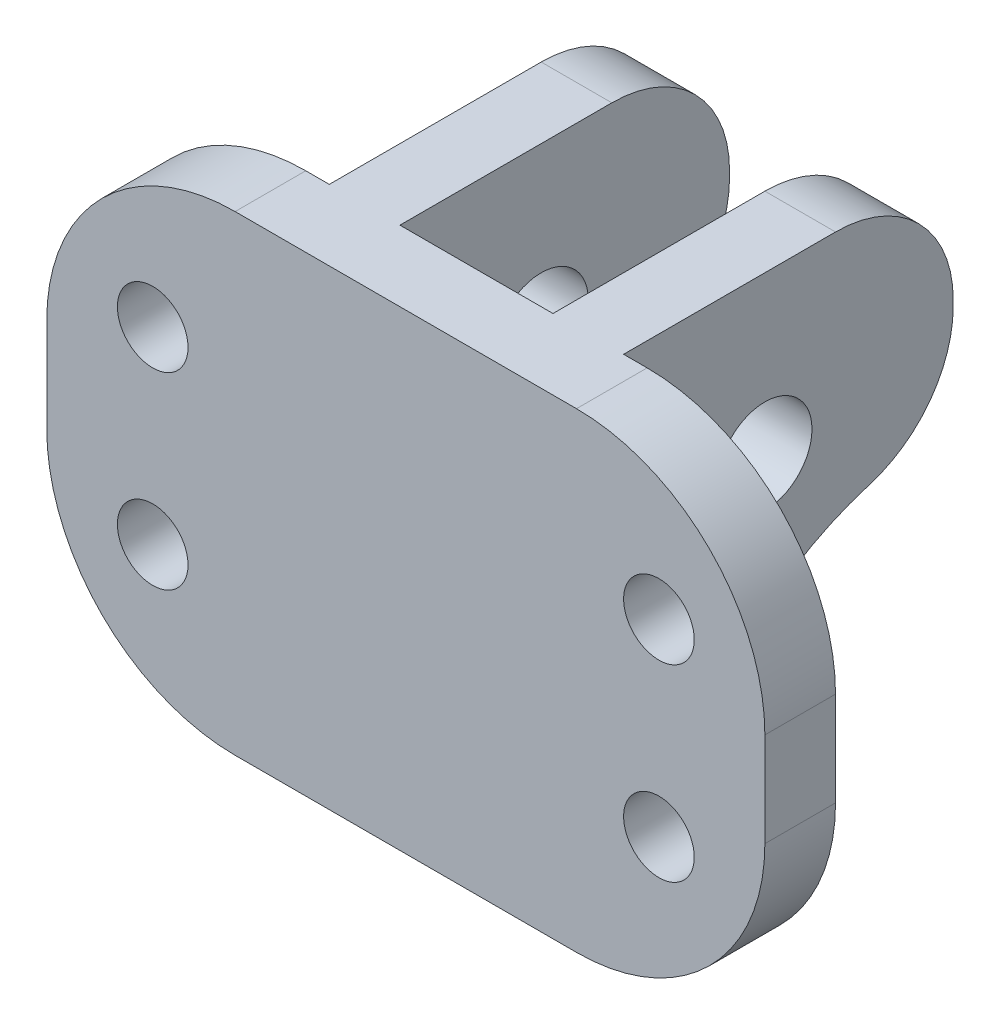
ISO-10303-21;
HEADER;
FILE_DESCRIPTION(('STEP AP214'),'2;1');
FILE_NAME('part.step','',(''),(''),'','','');
FILE_SCHEMA(('AUTOMOTIVE_DESIGN { 1 0 10303 214 1 1 1 1 }'));
ENDSEC;
DATA;
#1=APPLICATION_CONTEXT('core data for automotive mechanical design processes');
#2=APPLICATION_PROTOCOL_DEFINITION('international standard','automotive_design',2000,#1);
#3=PRODUCT_CONTEXT('',#1,'mechanical');
#4=PRODUCT('Part','Part','',(#3));
#5=PRODUCT_RELATED_PRODUCT_CATEGORY('part','',(#4));
#6=PRODUCT_DEFINITION_FORMATION('','',#4);
#7=PRODUCT_DEFINITION_CONTEXT('part definition',#1,'design');
#8=PRODUCT_DEFINITION('design','',#6,#7);
#9=PRODUCT_DEFINITION_SHAPE('','',#8);
#10=(LENGTH_UNIT() NAMED_UNIT(*) SI_UNIT(.MILLI.,.METRE.));
#11=(NAMED_UNIT(*) PLANE_ANGLE_UNIT() SI_UNIT($,.RADIAN.));
#12=(NAMED_UNIT(*) SI_UNIT($,.STERADIAN.) SOLID_ANGLE_UNIT());
#13=UNCERTAINTY_MEASURE_WITH_UNIT(LENGTH_MEASURE(1.E-05),#10,'distance_accuracy_value','');
#14=(GEOMETRIC_REPRESENTATION_CONTEXT(3) GLOBAL_UNCERTAINTY_ASSIGNED_CONTEXT((#13)) GLOBAL_UNIT_ASSIGNED_CONTEXT((#10,
#11,#12)) REPRESENTATION_CONTEXT('',''));
#15=CARTESIAN_POINT('',(0.,0.,0.));
#16=DIRECTION('',(0.,0.,1.));
#17=DIRECTION('',(1.,0.,0.));
#18=AXIS2_PLACEMENT_3D('',#15,#16,#17);
#19=CARTESIAN_POINT('',(-6.25,27.,0.));
#20=DIRECTION('',(-1.,0.,0.));
#21=DIRECTION('',(0.,0.,1.));
#22=AXIS2_PLACEMENT_3D('',#19,#20,#21);
#23=PLANE('',#22);
#24=DIRECTION('',(0.,-1.,0.));
#25=VECTOR('',#24,1.);
#26=CARTESIAN_POINT('',(-6.25,27.,-8.5));
#27=LINE('',#26,#25);
#28=CARTESIAN_POINT('',(-6.25,22.,-8.5));
#29=VERTEX_POINT('',#28);
#30=CARTESIAN_POINT('',(-6.25,21.7705098312484,-8.5));
#31=VERTEX_POINT('',#30);
#32=EDGE_CURVE('E291',#29,#31,#27,.T.);
#33=ORIENTED_EDGE('',*,*,#32,.T.);
#34=CARTESIAN_POINT('',(-6.25,21.7705098312484,-3.5));
#35=DIRECTION('',(-1.,0.,0.));
#36=DIRECTION('',(0.,0.,1.));
#37=AXIS2_PLACEMENT_3D('',#34,#35,#36);
#38=CIRCLE('',#37,5.);
#39=CARTESIAN_POINT('',(-6.25,16.9789355937489,-4.92857142857143));
#40=VERTEX_POINT('',#39);
#41=EDGE_CURVE('E370',#31,#40,#38,.T.);
#42=ORIENTED_EDGE('',*,*,#41,.T.);
#43=CARTESIAN_POINT('',(-6.25,5.,-8.5));
#44=DIRECTION('',(-1.,0.,0.));
#45=DIRECTION('',(0.,0.,1.));
#46=AXIS2_PLACEMENT_3D('',#43,#44,#45);
#47=CIRCLE('',#46,12.5);
#48=CARTESIAN_POINT('',(-6.25,7.,3.83896267925307));
#49=VERTEX_POINT('',#48);
#50=EDGE_CURVE('E380',#49,#40,#47,.T.);
#51=ORIENTED_EDGE('',*,*,#50,.F.);
#52=DIRECTION('',(0.,0.,-1.));
#53=VECTOR('',#52,1.);
#54=CARTESIAN_POINT('',(-6.25,7.,0.));
#55=LINE('',#54,#53);
#56=CARTESIAN_POINT('',(-6.25,7.,5.5));
#57=VERTEX_POINT('',#56);
#58=EDGE_CURVE('E390',#57,#49,#55,.T.);
#59=ORIENTED_EDGE('',*,*,#58,.F.);
#60=DIRECTION('',(0.,1.,0.));
#61=VECTOR('',#60,1.);
#62=CARTESIAN_POINT('',(-6.25,0.,5.5));
#63=LINE('',#62,#61);
#64=CARTESIAN_POINT('',(-6.25,27.,5.5));
#65=VERTEX_POINT('',#64);
#66=EDGE_CURVE('E253',#57,#65,#63,.T.);
#67=ORIENTED_EDGE('',*,*,#66,.T.);
#68=DIRECTION('',(0.,0.,-1.));
#69=VECTOR('',#68,1.);
#70=CARTESIAN_POINT('',(-6.25,27.,0.));
#71=LINE('',#70,#69);
#72=CARTESIAN_POINT('',(-6.25,27.,-3.5));
#73=VERTEX_POINT('',#72);
#74=EDGE_CURVE('E282',#65,#73,#71,.T.);
#75=ORIENTED_EDGE('',*,*,#74,.T.);
#76=CARTESIAN_POINT('',(-6.25,22.,-3.5));
#77=DIRECTION('',(-1.,0.,0.));
#78=DIRECTION('',(0.,0.,1.));
#79=AXIS2_PLACEMENT_3D('',#76,#77,#78);
#80=CIRCLE('',#79,5.);
#81=EDGE_CURVE('E314',#73,#29,#80,.T.);
#82=ORIENTED_EDGE('',*,*,#81,.T.);
#83=EDGE_LOOP('',(#33,#42,#51,#59,#67,#75,#82));
#84=FACE_BOUND('',#83,.T.);
#85=CARTESIAN_POINT('',(-6.25,20.25,-0.499999999999999));
#86=DIRECTION('',(1.,0.,0.));
#87=DIRECTION('',(0.,0.,1.));
#88=AXIS2_PLACEMENT_3D('',#85,#86,#87);
#89=CIRCLE('',#88,2.);
#90=CARTESIAN_POINT('',(-6.25,20.25,1.5));
#91=VERTEX_POINT('',#90);
#92=EDGE_CURVE('E264',#91,#91,#89,.T.);
#93=ORIENTED_EDGE('',*,*,#92,.T.);
#94=EDGE_LOOP('',(#93));
#95=FACE_BOUND('',#94,.T.);
#96=ADVANCED_FACE('F39',(#84,#95),#23,.T.);
#97=CARTESIAN_POINT('',(0.,27.,-8.5));
#98=DIRECTION('',(0.,0.,-1.));
#99=DIRECTION('',(-1.,0.,0.));
#100=AXIS2_PLACEMENT_3D('',#97,#98,#99);
#101=PLANE('',#100);
#102=DIRECTION('',(0.,-1.,0.));
#103=VECTOR('',#102,1.);
#104=CARTESIAN_POINT('',(6.25,27.,-8.5));
#105=LINE('',#104,#103);
#106=CARTESIAN_POINT('',(6.25,22.,-8.5));
#107=VERTEX_POINT('',#106);
#108=CARTESIAN_POINT('',(6.25,21.7705098312484,-8.5));
#109=VERTEX_POINT('',#108);
#110=EDGE_CURVE('E289',#107,#109,#105,.T.);
#111=ORIENTED_EDGE('',*,*,#110,.T.);
#112=DIRECTION('',(-1.,0.,0.));
#113=VECTOR('',#112,1.);
#114=CARTESIAN_POINT('',(3.25,21.7705098312484,-8.5));
#115=LINE('',#114,#113);
#116=CARTESIAN_POINT('',(3.25,21.7705098312484,-8.5));
#117=VERTEX_POINT('',#116);
#118=EDGE_CURVE('E47',#109,#117,#115,.T.);
#119=ORIENTED_EDGE('',*,*,#118,.T.);
#120=DIRECTION('',(0.,-1.,0.));
#121=VECTOR('',#120,1.);
#122=CARTESIAN_POINT('',(3.25,27.,-8.5));
#123=LINE('',#122,#121);
#124=CARTESIAN_POINT('',(3.25,22.,-8.5));
#125=VERTEX_POINT('',#124);
#126=EDGE_CURVE('E302',#125,#117,#123,.T.);
#127=ORIENTED_EDGE('',*,*,#126,.F.);
#128=DIRECTION('',(1.,0.,0.));
#129=VECTOR('',#128,1.);
#130=CARTESIAN_POINT('',(0.,22.,-8.5));
#131=LINE('',#130,#129);
#132=EDGE_CURVE('E319',#125,#107,#131,.T.);
#133=ORIENTED_EDGE('',*,*,#132,.T.);
#134=EDGE_LOOP('',(#111,#119,#127,#133));
#135=FACE_BOUND('',#134,.T.);
#136=ADVANCED_FACE('F434',(#135),#101,.T.);
#137=CARTESIAN_POINT('',(3.25,27.,0.));
#138=DIRECTION('',(1.,0.,0.));
#139=DIRECTION('',(0.,0.,-1.));
#140=AXIS2_PLACEMENT_3D('',#137,#138,#139);
#141=PLANE('',#140);
#142=CARTESIAN_POINT('',(3.25,20.25,-0.499999999999999));
#143=DIRECTION('',(1.,0.,0.));
#144=DIRECTION('',(0.,0.,-1.));
#145=AXIS2_PLACEMENT_3D('',#142,#143,#144);
#146=CIRCLE('',#145,2.);
#147=CARTESIAN_POINT('',(3.25,20.25,-2.5));
#148=VERTEX_POINT('',#147);
#149=EDGE_CURVE('E272',#148,#148,#146,.T.);
#150=ORIENTED_EDGE('',*,*,#149,.T.);
#151=EDGE_LOOP('',(#150));
#152=FACE_BOUND('',#151,.T.);
#153=ORIENTED_EDGE('',*,*,#126,.T.);
#154=CARTESIAN_POINT('',(3.25,21.7705098312484,-3.5));
#155=DIRECTION('',(1.,0.,0.));
#156=DIRECTION('',(0.,0.,-1.));
#157=AXIS2_PLACEMENT_3D('',#154,#155,#156);
#158=CIRCLE('',#157,5.);
#159=CARTESIAN_POINT('',(3.25,16.9789355937489,-4.92857142857143));
#160=VERTEX_POINT('',#159);
#161=EDGE_CURVE('E11',#117,#160,#158,.F.);
#162=ORIENTED_EDGE('',*,*,#161,.T.);
#163=CARTESIAN_POINT('',(3.25,5.,-8.5));
#164=DIRECTION('',(1.,0.,0.));
#165=DIRECTION('',(0.,0.,-1.));
#166=AXIS2_PLACEMENT_3D('',#163,#164,#165);
#167=CIRCLE('',#166,12.5);
#168=CARTESIAN_POINT('',(3.25,7.,3.83896267925307));
#169=VERTEX_POINT('',#168);
#170=EDGE_CURVE('E187',#160,#169,#167,.T.);
#171=ORIENTED_EDGE('',*,*,#170,.T.);
#172=DIRECTION('',(0.,0.,1.));
#173=VECTOR('',#172,1.);
#174=CARTESIAN_POINT('',(3.25,7.,0.));
#175=LINE('',#174,#173);
#176=CARTESIAN_POINT('',(3.25,7.,5.5));
#177=VERTEX_POINT('',#176);
#178=EDGE_CURVE('E192',#169,#177,#175,.T.);
#179=ORIENTED_EDGE('',*,*,#178,.T.);
#180=DIRECTION('',(0.,-1.,0.));
#181=VECTOR('',#180,1.);
#182=CARTESIAN_POINT('',(3.25,27.,5.5));
#183=LINE('',#182,#181);
#184=CARTESIAN_POINT('',(3.25,27.,5.5));
#185=VERTEX_POINT('',#184);
#186=EDGE_CURVE('E300',#185,#177,#183,.T.);
#187=ORIENTED_EDGE('',*,*,#186,.F.);
#188=DIRECTION('',(0.,0.,1.));
#189=VECTOR('',#188,1.);
#190=CARTESIAN_POINT('',(3.25,27.,0.));
#191=LINE('',#190,#189);
#192=CARTESIAN_POINT('',(3.25,27.,-3.5));
#193=VERTEX_POINT('',#192);
#194=EDGE_CURVE('E275',#193,#185,#191,.T.);
#195=ORIENTED_EDGE('',*,*,#194,.F.);
#196=CARTESIAN_POINT('',(3.25,22.,-3.5));
#197=DIRECTION('',(1.,0.,0.));
#198=DIRECTION('',(0.,0.,-1.));
#199=AXIS2_PLACEMENT_3D('',#196,#197,#198);
#200=CIRCLE('',#199,5.);
#201=EDGE_CURVE('E322',#193,#125,#200,.F.);
#202=ORIENTED_EDGE('',*,*,#201,.T.);
#203=EDGE_LOOP('',(#153,#162,#171,#179,#187,#195,#202));
#204=FACE_BOUND('',#203,.T.);
#205=ADVANCED_FACE('F189',(#152,#204),#141,.F.);
#206=CARTESIAN_POINT('',(0.,27.,5.5));
#207=DIRECTION('',(0.,0.,-1.));
#208=DIRECTION('',(-1.,0.,0.));
#209=AXIS2_PLACEMENT_3D('',#206,#207,#208);
#210=PLANE('',#209);
#211=DIRECTION('',(1.,0.,0.));
#212=VECTOR('',#211,1.);
#213=CARTESIAN_POINT('',(0.,7.,5.5));
#214=LINE('',#213,#212);
#215=CARTESIAN_POINT('',(-3.25,7.,5.5));
#216=VERTEX_POINT('',#215);
#217=EDGE_CURVE('E212',#216,#177,#214,.T.);
#218=ORIENTED_EDGE('',*,*,#217,.F.);
#219=DIRECTION('',(0.,-1.,0.));
#220=VECTOR('',#219,1.);
#221=CARTESIAN_POINT('',(-3.25,27.,5.5));
#222=LINE('',#221,#220);
#223=CARTESIAN_POINT('',(-3.25,27.,5.5));
#224=VERTEX_POINT('',#223);
#225=EDGE_CURVE('E297',#224,#216,#222,.T.);
#226=ORIENTED_EDGE('',*,*,#225,.F.);
#227=DIRECTION('',(1.,0.,0.));
#228=VECTOR('',#227,1.);
#229=CARTESIAN_POINT('',(0.,27.,5.5));
#230=LINE('',#229,#228);
#231=EDGE_CURVE('E277',#224,#185,#230,.T.);
#232=ORIENTED_EDGE('',*,*,#231,.T.);
#233=ORIENTED_EDGE('',*,*,#186,.T.);
#234=EDGE_LOOP('',(#218,#226,#232,#233));
#235=FACE_BOUND('',#234,.T.);
#236=ADVANCED_FACE('F397',(#235),#210,.T.);
#237=CARTESIAN_POINT('',(-3.25,27.,0.));
#238=DIRECTION('',(1.,0.,0.));
#239=DIRECTION('',(0.,0.,-1.));
#240=AXIS2_PLACEMENT_3D('',#237,#238,#239);
#241=PLANE('',#240);
#242=CARTESIAN_POINT('',(-3.25,5.,-8.5));
#243=DIRECTION('',(1.,0.,0.));
#244=DIRECTION('',(0.,0.,-1.));
#245=AXIS2_PLACEMENT_3D('',#242,#243,#244);
#246=CIRCLE('',#245,12.5);
#247=CARTESIAN_POINT('',(-3.25,16.9789355937489,-4.92857142857143));
#248=VERTEX_POINT('',#247);
#249=CARTESIAN_POINT('',(-3.25,7.,3.83896267925307));
#250=VERTEX_POINT('',#249);
#251=EDGE_CURVE('E198',#248,#250,#246,.T.);
#252=ORIENTED_EDGE('',*,*,#251,.F.);
#253=CARTESIAN_POINT('',(-3.25,21.7705098312484,-3.5));
#254=DIRECTION('',(1.,0.,0.));
#255=DIRECTION('',(0.,0.,-1.));
#256=AXIS2_PLACEMENT_3D('',#253,#254,#255);
#257=CIRCLE('',#256,5.);
#258=CARTESIAN_POINT('',(-3.25,21.7705098312484,-8.5));
#259=VERTEX_POINT('',#258);
#260=EDGE_CURVE('E366',#248,#259,#257,.T.);
#261=ORIENTED_EDGE('',*,*,#260,.T.);
#262=DIRECTION('',(0.,-1.,0.));
#263=VECTOR('',#262,1.);
#264=CARTESIAN_POINT('',(-3.25,27.,-8.5));
#265=LINE('',#264,#263);
#266=CARTESIAN_POINT('',(-3.25,22.,-8.5));
#267=VERTEX_POINT('',#266);
#268=EDGE_CURVE('E294',#267,#259,#265,.T.);
#269=ORIENTED_EDGE('',*,*,#268,.F.);
#270=CARTESIAN_POINT('',(-3.25,22.,-3.5));
#271=DIRECTION('',(1.,0.,0.));
#272=DIRECTION('',(0.,0.,-1.));
#273=AXIS2_PLACEMENT_3D('',#270,#271,#272);
#274=CIRCLE('',#273,5.);
#275=CARTESIAN_POINT('',(-3.25,27.,-3.5));
#276=VERTEX_POINT('',#275);
#277=EDGE_CURVE('E307',#267,#276,#274,.T.);
#278=ORIENTED_EDGE('',*,*,#277,.T.);
#279=DIRECTION('',(0.,0.,1.));
#280=VECTOR('',#279,1.);
#281=CARTESIAN_POINT('',(-3.25,27.,0.));
#282=LINE('',#281,#280);
#283=EDGE_CURVE('E280',#276,#224,#282,.T.);
#284=ORIENTED_EDGE('',*,*,#283,.T.);
#285=ORIENTED_EDGE('',*,*,#225,.T.);
#286=DIRECTION('',(0.,0.,1.));
#287=VECTOR('',#286,1.);
#288=CARTESIAN_POINT('',(-3.25,7.,0.));
#289=LINE('',#288,#287);
#290=EDGE_CURVE('E219',#250,#216,#289,.T.);
#291=ORIENTED_EDGE('',*,*,#290,.F.);
#292=EDGE_LOOP('',(#252,#261,#269,#278,#284,#285,#291));
#293=FACE_BOUND('',#292,.T.);
#294=CARTESIAN_POINT('',(-3.25,20.25,-0.499999999999999));
#295=DIRECTION('',(1.,0.,0.));
#296=DIRECTION('',(0.,0.,-1.));
#297=AXIS2_PLACEMENT_3D('',#294,#295,#296);
#298=CIRCLE('',#297,2.);
#299=CARTESIAN_POINT('',(-3.25,20.25,-2.5));
#300=VERTEX_POINT('',#299);
#301=EDGE_CURVE('E267',#300,#300,#298,.T.);
#302=ORIENTED_EDGE('',*,*,#301,.F.);
#303=EDGE_LOOP('',(#302));
#304=FACE_BOUND('',#303,.T.);
#305=ADVANCED_FACE('F399',(#293,#304),#241,.T.);
#306=ORIENTED_EDGE('',*,*,#268,.T.);
#307=DIRECTION('',(-1.,0.,0.));
#308=VECTOR('',#307,1.);
#309=CARTESIAN_POINT('',(-6.25,21.7705098312484,-8.5));
#310=LINE('',#309,#308);
#311=EDGE_CURVE('E368',#259,#31,#310,.T.);
#312=ORIENTED_EDGE('',*,*,#311,.T.);
#313=ORIENTED_EDGE('',*,*,#32,.F.);
#314=DIRECTION('',(1.,0.,0.));
#315=VECTOR('',#314,1.);
#316=CARTESIAN_POINT('',(0.,22.,-8.5));
#317=LINE('',#316,#315);
#318=EDGE_CURVE('E304',#29,#267,#317,.T.);
#319=ORIENTED_EDGE('',*,*,#318,.T.);
#320=EDGE_LOOP('',(#306,#312,#313,#319));
#321=FACE_BOUND('',#320,.T.);
#322=ADVANCED_FACE('F416',(#321),#101,.T.);
#323=CARTESIAN_POINT('',(0.,27.,8.5));
#324=DIRECTION('',(0.,0.,-1.));
#325=DIRECTION('',(-1.,0.,0.));
#326=AXIS2_PLACEMENT_3D('',#323,#324,#325);
#327=PLANE('',#326);
#328=DIRECTION('',(0.,-1.,0.));
#329=VECTOR('',#328,1.);
#330=CARTESIAN_POINT('',(-15.25,0.,8.5));
#331=LINE('',#330,#329);
#332=CARTESIAN_POINT('',(-15.25,19.,8.5));
#333=VERTEX_POINT('',#332);
#334=CARTESIAN_POINT('',(-15.25,15.,8.5));
#335=VERTEX_POINT('',#334);
#336=EDGE_CURVE('E250',#333,#335,#331,.T.);
#337=ORIENTED_EDGE('',*,*,#336,.T.);
#338=CARTESIAN_POINT('',(-7.25,15.,8.5));
#339=DIRECTION('',(0.,0.,-1.));
#340=DIRECTION('',(-1.,0.,0.));
#341=AXIS2_PLACEMENT_3D('',#338,#339,#340);
#342=CIRCLE('',#341,8.);
#343=CARTESIAN_POINT('',(-7.25,7.,8.5));
#344=VERTEX_POINT('',#343);
#345=EDGE_CURVE('E358',#335,#344,#342,.F.);
#346=ORIENTED_EDGE('',*,*,#345,.T.);
#347=DIRECTION('',(-1.,0.,0.));
#348=VECTOR('',#347,1.);
#349=CARTESIAN_POINT('',(-19.3327148454112,7.,8.5));
#350=LINE('',#349,#348);
#351=CARTESIAN_POINT('',(7.25,7.,8.5));
#352=VERTEX_POINT('',#351);
#353=EDGE_CURVE('E383',#352,#344,#350,.T.);
#354=ORIENTED_EDGE('',*,*,#353,.F.);
#355=CARTESIAN_POINT('',(7.25,15.,8.5));
#356=DIRECTION('',(0.,0.,-1.));
#357=DIRECTION('',(-1.,0.,0.));
#358=AXIS2_PLACEMENT_3D('',#355,#356,#357);
#359=CIRCLE('',#358,8.);
#360=CARTESIAN_POINT('',(15.25,15.,8.5));
#361=VERTEX_POINT('',#360);
#362=EDGE_CURVE('E356',#352,#361,#359,.F.);
#363=ORIENTED_EDGE('',*,*,#362,.T.);
#364=DIRECTION('',(0.,1.,0.));
#365=VECTOR('',#364,1.);
#366=CARTESIAN_POINT('',(15.25,0.,8.5));
#367=LINE('',#366,#365);
#368=CARTESIAN_POINT('',(15.25,19.,8.5));
#369=VERTEX_POINT('',#368);
#370=EDGE_CURVE('E229',#361,#369,#367,.T.);
#371=ORIENTED_EDGE('',*,*,#370,.T.);
#372=CARTESIAN_POINT('',(7.25,19.,8.5));
#373=DIRECTION('',(0.,0.,-1.));
#374=DIRECTION('',(-1.,0.,0.));
#375=AXIS2_PLACEMENT_3D('',#372,#373,#374);
#376=CIRCLE('',#375,8.);
#377=CARTESIAN_POINT('',(7.25,27.,8.5));
#378=VERTEX_POINT('',#377);
#379=EDGE_CURVE('E329',#369,#378,#376,.F.);
#380=ORIENTED_EDGE('',*,*,#379,.T.);
#381=DIRECTION('',(1.,0.,0.));
#382=VECTOR('',#381,1.);
#383=CARTESIAN_POINT('',(0.,27.,8.5));
#384=LINE('',#383,#382);
#385=CARTESIAN_POINT('',(-7.25,27.,8.5));
#386=VERTEX_POINT('',#385);
#387=EDGE_CURVE('E284',#386,#378,#384,.T.);
#388=ORIENTED_EDGE('',*,*,#387,.F.);
#389=CARTESIAN_POINT('',(-7.25,19.,8.5));
#390=DIRECTION('',(0.,0.,-1.));
#391=DIRECTION('',(-1.,0.,0.));
#392=AXIS2_PLACEMENT_3D('',#389,#390,#391);
#393=CIRCLE('',#392,8.);
#394=EDGE_CURVE('E327',#386,#333,#393,.F.);
#395=ORIENTED_EDGE('',*,*,#394,.T.);
#396=EDGE_LOOP('',(#337,#346,#354,#363,#371,#380,#388,#395));
#397=FACE_BOUND('',#396,.T.);
#398=CARTESIAN_POINT('',(-10.75,21.,8.5));
#399=DIRECTION('',(0.,0.,1.));
#400=DIRECTION('',(1.,0.,0.));
#401=AXIS2_PLACEMENT_3D('',#398,#399,#400);
#402=CIRCLE('',#401,1.5);
#403=CARTESIAN_POINT('',(-9.25,21.,8.5));
#404=VERTEX_POINT('',#403);
#405=EDGE_CURVE('E239',#404,#404,#402,.T.);
#406=ORIENTED_EDGE('',*,*,#405,.F.);
#407=EDGE_LOOP('',(#406));
#408=FACE_BOUND('',#407,.T.);
#409=CARTESIAN_POINT('',(-10.75,13.,8.5));
#410=DIRECTION('',(0.,0.,1.));
#411=DIRECTION('',(1.,0.,0.));
#412=AXIS2_PLACEMENT_3D('',#409,#410,#411);
#413=CIRCLE('',#412,1.5);
#414=CARTESIAN_POINT('',(-9.25,13.,8.5));
#415=VERTEX_POINT('',#414);
#416=EDGE_CURVE('E244',#415,#415,#413,.T.);
#417=ORIENTED_EDGE('',*,*,#416,.F.);
#418=EDGE_LOOP('',(#417));
#419=FACE_BOUND('',#418,.T.);
#420=CARTESIAN_POINT('',(10.75,21.,8.5));
#421=DIRECTION('',(0.,0.,1.));
#422=DIRECTION('',(1.,0.,0.));
#423=AXIS2_PLACEMENT_3D('',#420,#421,#422);
#424=CIRCLE('',#423,1.5);
#425=CARTESIAN_POINT('',(12.25,21.,8.5));
#426=VERTEX_POINT('',#425);
#427=EDGE_CURVE('E214',#426,#426,#424,.T.);
#428=ORIENTED_EDGE('',*,*,#427,.F.);
#429=EDGE_LOOP('',(#428));
#430=FACE_BOUND('',#429,.T.);
#431=CARTESIAN_POINT('',(10.75,13.,8.5));
#432=DIRECTION('',(0.,0.,1.));
#433=DIRECTION('',(1.,0.,0.));
#434=AXIS2_PLACEMENT_3D('',#431,#432,#433);
#435=CIRCLE('',#434,1.5);
#436=CARTESIAN_POINT('',(12.25,13.,8.5));
#437=VERTEX_POINT('',#436);
#438=EDGE_CURVE('E224',#437,#437,#435,.T.);
#439=ORIENTED_EDGE('',*,*,#438,.F.);
#440=EDGE_LOOP('',(#439));
#441=FACE_BOUND('',#440,.T.);
#442=ADVANCED_FACE('F441',(#397,#408,#419,#430,#441),#327,.F.);
#443=CARTESIAN_POINT('',(6.25,27.,0.));
#444=DIRECTION('',(-1.,0.,0.));
#445=DIRECTION('',(0.,0.,1.));
#446=AXIS2_PLACEMENT_3D('',#443,#444,#445);
#447=PLANE('',#446);
#448=CARTESIAN_POINT('',(6.25,20.25,-0.499999999999999));
#449=DIRECTION('',(1.,0.,0.));
#450=DIRECTION('',(0.,0.,1.));
#451=AXIS2_PLACEMENT_3D('',#448,#449,#450);
#452=CIRCLE('',#451,2.);
#453=CARTESIAN_POINT('',(6.25,20.25,1.5));
#454=VERTEX_POINT('',#453);
#455=EDGE_CURVE('E261',#454,#454,#452,.T.);
#456=ORIENTED_EDGE('',*,*,#455,.F.);
#457=EDGE_LOOP('',(#456));
#458=FACE_BOUND('',#457,.T.);
#459=CARTESIAN_POINT('',(6.25,5.,-8.5));
#460=DIRECTION('',(1.,0.,0.));
#461=DIRECTION('',(0.,0.,-1.));
#462=AXIS2_PLACEMENT_3D('',#459,#460,#461);
#463=CIRCLE('',#462,12.5);
#464=CARTESIAN_POINT('',(6.25,16.9789355937489,-4.92857142857143));
#465=VERTEX_POINT('',#464);
#466=CARTESIAN_POINT('',(6.25,7.,3.83896267925307));
#467=VERTEX_POINT('',#466);
#468=EDGE_CURVE('E199',#465,#467,#463,.T.);
#469=ORIENTED_EDGE('',*,*,#468,.F.);
#470=CARTESIAN_POINT('',(6.25,21.7705098312484,-3.5));
#471=DIRECTION('',(-1.,0.,0.));
#472=DIRECTION('',(0.,0.,1.));
#473=AXIS2_PLACEMENT_3D('',#470,#471,#472);
#474=CIRCLE('',#473,5.);
#475=EDGE_CURVE('E61',#465,#109,#474,.F.);
#476=ORIENTED_EDGE('',*,*,#475,.T.);
#477=ORIENTED_EDGE('',*,*,#110,.F.);
#478=CARTESIAN_POINT('',(6.25,22.,-3.5));
#479=DIRECTION('',(-1.,0.,0.));
#480=DIRECTION('',(0.,0.,1.));
#481=AXIS2_PLACEMENT_3D('',#478,#479,#480);
#482=CIRCLE('',#481,5.);
#483=CARTESIAN_POINT('',(6.25,27.,-3.5));
#484=VERTEX_POINT('',#483);
#485=EDGE_CURVE('E316',#107,#484,#482,.F.);
#486=ORIENTED_EDGE('',*,*,#485,.T.);
#487=DIRECTION('',(0.,0.,-1.));
#488=VECTOR('',#487,1.);
#489=CARTESIAN_POINT('',(6.25,27.,0.));
#490=LINE('',#489,#488);
#491=CARTESIAN_POINT('',(6.25,27.,5.5));
#492=VERTEX_POINT('',#491);
#493=EDGE_CURVE('E287',#492,#484,#490,.T.);
#494=ORIENTED_EDGE('',*,*,#493,.F.);
#495=DIRECTION('',(0.,-1.,0.));
#496=VECTOR('',#495,1.);
#497=CARTESIAN_POINT('',(6.25,0.,5.5));
#498=LINE('',#497,#496);
#499=CARTESIAN_POINT('',(6.25,7.,5.5));
#500=VERTEX_POINT('',#499);
#501=EDGE_CURVE('E232',#492,#500,#498,.T.);
#502=ORIENTED_EDGE('',*,*,#501,.T.);
#503=DIRECTION('',(0.,0.,-1.));
#504=VECTOR('',#503,1.);
#505=CARTESIAN_POINT('',(6.25,7.,0.));
#506=LINE('',#505,#504);
#507=EDGE_CURVE('E376',#500,#467,#506,.T.);
#508=ORIENTED_EDGE('',*,*,#507,.T.);
#509=EDGE_LOOP('',(#469,#476,#477,#486,#494,#502,#508));
#510=FACE_BOUND('',#509,.T.);
#511=ADVANCED_FACE('F375',(#458,#510),#447,.F.);
#512=CARTESIAN_POINT('',(0.,27.,0.));
#513=DIRECTION('',(0.,1.,0.));
#514=DIRECTION('',(0.,0.,1.));
#515=AXIS2_PLACEMENT_3D('',#512,#513,#514);
#516=PLANE('',#515);
#517=ORIENTED_EDGE('',*,*,#387,.T.);
#518=DIRECTION('',(0.,0.,1.));
#519=VECTOR('',#518,1.);
#520=CARTESIAN_POINT('',(7.25,27.,0.));
#521=LINE('',#520,#519);
#522=CARTESIAN_POINT('',(7.25,27.,5.5));
#523=VERTEX_POINT('',#522);
#524=EDGE_CURVE('E334',#378,#523,#521,.F.);
#525=ORIENTED_EDGE('',*,*,#524,.T.);
#526=DIRECTION('',(-1.,0.,0.));
#527=VECTOR('',#526,1.);
#528=CARTESIAN_POINT('',(6.25,27.,5.5));
#529=LINE('',#528,#527);
#530=EDGE_CURVE('E237',#523,#492,#529,.T.);
#531=ORIENTED_EDGE('',*,*,#530,.T.);
#532=ORIENTED_EDGE('',*,*,#493,.T.);
#533=DIRECTION('',(1.,0.,0.));
#534=VECTOR('',#533,1.);
#535=CARTESIAN_POINT('',(0.,27.,-3.5));
#536=LINE('',#535,#534);
#537=EDGE_CURVE('E309',#484,#193,#536,.F.);
#538=ORIENTED_EDGE('',*,*,#537,.T.);
#539=ORIENTED_EDGE('',*,*,#194,.T.);
#540=ORIENTED_EDGE('',*,*,#231,.F.);
#541=ORIENTED_EDGE('',*,*,#283,.F.);
#542=DIRECTION('',(1.,0.,0.));
#543=VECTOR('',#542,1.);
#544=CARTESIAN_POINT('',(0.,27.,-3.5));
#545=LINE('',#544,#543);
#546=EDGE_CURVE('E311',#276,#73,#545,.F.);
#547=ORIENTED_EDGE('',*,*,#546,.T.);
#548=ORIENTED_EDGE('',*,*,#74,.F.);
#549=DIRECTION('',(-1.,0.,0.));
#550=VECTOR('',#549,1.);
#551=CARTESIAN_POINT('',(-6.25,27.,5.5));
#552=LINE('',#551,#550);
#553=CARTESIAN_POINT('',(-7.25,27.,5.5));
#554=VERTEX_POINT('',#553);
#555=EDGE_CURVE('E255',#65,#554,#552,.T.);
#556=ORIENTED_EDGE('',*,*,#555,.T.);
#557=DIRECTION('',(0.,0.,1.));
#558=VECTOR('',#557,1.);
#559=CARTESIAN_POINT('',(-7.25,27.,0.));
#560=LINE('',#559,#558);
#561=EDGE_CURVE('E331',#554,#386,#560,.T.);
#562=ORIENTED_EDGE('',*,*,#561,.T.);
#563=EDGE_LOOP('',(#517,#525,#531,#532,#538,#539,#540,#541,#547,#548,#556,#562));
#564=FACE_BOUND('',#563,.T.);
#565=ADVANCED_FACE('F405',(#564),#516,.T.);
#566=CARTESIAN_POINT('',(-6.25,20.25,-0.499999999999999));
#567=DIRECTION('',(1.,0.,0.));
#568=DIRECTION('',(0.,0.,-1.));
#569=AXIS2_PLACEMENT_3D('',#566,#567,#568);
#570=CYLINDRICAL_SURFACE('',#569,2.);
#571=ORIENTED_EDGE('',*,*,#455,.T.);
#572=EDGE_LOOP('',(#571));
#573=FACE_BOUND('',#572,.T.);
#574=ORIENTED_EDGE('',*,*,#149,.F.);
#575=EDGE_LOOP('',(#574));
#576=FACE_BOUND('',#575,.T.);
#577=ADVANCED_FACE('F516',(#573,#576),#570,.F.);
#578=ORIENTED_EDGE('',*,*,#301,.T.);
#579=EDGE_LOOP('',(#578));
#580=FACE_BOUND('',#579,.T.);
#581=ORIENTED_EDGE('',*,*,#92,.F.);
#582=EDGE_LOOP('',(#581));
#583=FACE_BOUND('',#582,.T.);
#584=ADVANCED_FACE('F455',(#580,#583),#570,.F.);
#585=CARTESIAN_POINT('',(0.,22.,-3.5));
#586=DIRECTION('',(1.,0.,0.));
#587=DIRECTION('',(0.,0.,-1.));
#588=AXIS2_PLACEMENT_3D('',#585,#586,#587);
#589=CYLINDRICAL_SURFACE('',#588,5.);
#590=ORIENTED_EDGE('',*,*,#81,.F.);
#591=ORIENTED_EDGE('',*,*,#546,.F.);
#592=ORIENTED_EDGE('',*,*,#277,.F.);
#593=ORIENTED_EDGE('',*,*,#318,.F.);
#594=EDGE_LOOP('',(#590,#591,#592,#593));
#595=FACE_BOUND('',#594,.T.);
#596=ADVANCED_FACE('F409',(#595),#589,.T.);
#597=CARTESIAN_POINT('',(0.,22.,-3.5));
#598=DIRECTION('',(1.,0.,0.));
#599=DIRECTION('',(0.,0.,-1.));
#600=AXIS2_PLACEMENT_3D('',#597,#598,#599);
#601=CYLINDRICAL_SURFACE('',#600,5.);
#602=ORIENTED_EDGE('',*,*,#201,.F.);
#603=ORIENTED_EDGE('',*,*,#537,.F.);
#604=ORIENTED_EDGE('',*,*,#485,.F.);
#605=ORIENTED_EDGE('',*,*,#132,.F.);
#606=EDGE_LOOP('',(#602,#603,#604,#605));
#607=FACE_BOUND('',#606,.T.);
#608=ADVANCED_FACE('F454',(#607),#601,.T.);
#609=CARTESIAN_POINT('',(-15.25,0.,5.5));
#610=DIRECTION('',(-1.,0.,0.));
#611=DIRECTION('',(0.,0.,1.));
#612=AXIS2_PLACEMENT_3D('',#609,#610,#611);
#613=PLANE('',#612);
#614=DIRECTION('',(0.,-1.,0.));
#615=VECTOR('',#614,1.);
#616=CARTESIAN_POINT('',(-15.25,0.,5.5));
#617=LINE('',#616,#615);
#618=CARTESIAN_POINT('',(-15.25,19.,5.5));
#619=VERTEX_POINT('',#618);
#620=CARTESIAN_POINT('',(-15.25,15.,5.5));
#621=VERTEX_POINT('',#620);
#622=EDGE_CURVE('E258',#619,#621,#617,.T.);
#623=ORIENTED_EDGE('',*,*,#622,.T.);
#624=DIRECTION('',(0.,0.,-1.));
#625=VECTOR('',#624,1.);
#626=CARTESIAN_POINT('',(-15.25,15.,8.5));
#627=LINE('',#626,#625);
#628=EDGE_CURVE('E354',#621,#335,#627,.F.);
#629=ORIENTED_EDGE('',*,*,#628,.T.);
#630=ORIENTED_EDGE('',*,*,#336,.F.);
#631=DIRECTION('',(0.,0.,1.));
#632=VECTOR('',#631,1.);
#633=CARTESIAN_POINT('',(-15.25,19.,5.5));
#634=LINE('',#633,#632);
#635=EDGE_CURVE('E339',#333,#619,#634,.F.);
#636=ORIENTED_EDGE('',*,*,#635,.T.);
#637=EDGE_LOOP('',(#623,#629,#630,#636));
#638=FACE_BOUND('',#637,.T.);
#639=ADVANCED_FACE('F458',(#638),#613,.T.);
#640=CARTESIAN_POINT('',(0.,0.,5.5));
#641=DIRECTION('',(0.,0.,1.));
#642=DIRECTION('',(1.,0.,0.));
#643=AXIS2_PLACEMENT_3D('',#640,#641,#642);
#644=PLANE('',#643);
#645=CARTESIAN_POINT('',(-10.75,21.,5.5));
#646=DIRECTION('',(0.,0.,1.));
#647=DIRECTION('',(1.,0.,0.));
#648=AXIS2_PLACEMENT_3D('',#645,#646,#647);
#649=CIRCLE('',#648,1.5);
#650=CARTESIAN_POINT('',(-9.25,21.,5.5));
#651=VERTEX_POINT('',#650);
#652=EDGE_CURVE('E241',#651,#651,#649,.T.);
#653=ORIENTED_EDGE('',*,*,#652,.T.);
#654=EDGE_LOOP('',(#653));
#655=FACE_BOUND('',#654,.T.);
#656=CARTESIAN_POINT('',(-10.75,13.,5.5));
#657=DIRECTION('',(0.,0.,1.));
#658=DIRECTION('',(1.,0.,0.));
#659=AXIS2_PLACEMENT_3D('',#656,#657,#658);
#660=CIRCLE('',#659,1.5);
#661=CARTESIAN_POINT('',(-9.25,13.,5.5));
#662=VERTEX_POINT('',#661);
#663=EDGE_CURVE('E247',#662,#662,#660,.T.);
#664=ORIENTED_EDGE('',*,*,#663,.T.);
#665=EDGE_LOOP('',(#664));
#666=FACE_BOUND('',#665,.T.);
#667=DIRECTION('',(-1.,0.,0.));
#668=VECTOR('',#667,1.);
#669=CARTESIAN_POINT('',(0.,7.,5.5));
#670=LINE('',#669,#668);
#671=CARTESIAN_POINT('',(-7.25,7.,5.5));
#672=VERTEX_POINT('',#671);
#673=EDGE_CURVE('E387',#57,#672,#670,.T.);
#674=ORIENTED_EDGE('',*,*,#673,.T.);
#675=CARTESIAN_POINT('',(-7.25,15.,5.5));
#676=DIRECTION('',(0.,0.,1.));
#677=DIRECTION('',(1.,0.,0.));
#678=AXIS2_PLACEMENT_3D('',#675,#676,#677);
#679=CIRCLE('',#678,8.);
#680=EDGE_CURVE('E352',#672,#621,#679,.F.);
#681=ORIENTED_EDGE('',*,*,#680,.T.);
#682=ORIENTED_EDGE('',*,*,#622,.F.);
#683=CARTESIAN_POINT('',(-7.25,19.,5.5));
#684=DIRECTION('',(0.,0.,1.));
#685=DIRECTION('',(1.,0.,0.));
#686=AXIS2_PLACEMENT_3D('',#683,#684,#685);
#687=CIRCLE('',#686,8.);
#688=EDGE_CURVE('E341',#619,#554,#687,.F.);
#689=ORIENTED_EDGE('',*,*,#688,.T.);
#690=ORIENTED_EDGE('',*,*,#555,.F.);
#691=ORIENTED_EDGE('',*,*,#66,.F.);
#692=EDGE_LOOP('',(#674,#681,#682,#689,#690,#691));
#693=FACE_BOUND('',#692,.T.);
#694=ADVANCED_FACE('F496',(#655,#666,#693),#644,.F.);
#695=CARTESIAN_POINT('',(-10.75,13.,5.5));
#696=DIRECTION('',(0.,0.,1.));
#697=DIRECTION('',(1.,0.,0.));
#698=AXIS2_PLACEMENT_3D('',#695,#696,#697);
#699=CYLINDRICAL_SURFACE('',#698,1.5);
#700=ORIENTED_EDGE('',*,*,#663,.F.);
#701=EDGE_LOOP('',(#700));
#702=FACE_BOUND('',#701,.T.);
#703=ORIENTED_EDGE('',*,*,#416,.T.);
#704=EDGE_LOOP('',(#703));
#705=FACE_BOUND('',#704,.T.);
#706=ADVANCED_FACE('F509',(#702,#705),#699,.F.);
#707=CARTESIAN_POINT('',(-10.75,21.,5.5));
#708=DIRECTION('',(0.,0.,1.));
#709=DIRECTION('',(1.,0.,0.));
#710=AXIS2_PLACEMENT_3D('',#707,#708,#709);
#711=CYLINDRICAL_SURFACE('',#710,1.5);
#712=ORIENTED_EDGE('',*,*,#652,.F.);
#713=EDGE_LOOP('',(#712));
#714=FACE_BOUND('',#713,.T.);
#715=ORIENTED_EDGE('',*,*,#405,.T.);
#716=EDGE_LOOP('',(#715));
#717=FACE_BOUND('',#716,.T.);
#718=ADVANCED_FACE('F555',(#714,#717),#711,.F.);
#719=CARTESIAN_POINT('',(15.25,0.,5.5));
#720=DIRECTION('',(1.,0.,0.));
#721=DIRECTION('',(0.,0.,-1.));
#722=AXIS2_PLACEMENT_3D('',#719,#720,#721);
#723=PLANE('',#722);
#724=ORIENTED_EDGE('',*,*,#370,.F.);
#725=DIRECTION('',(0.,0.,1.));
#726=VECTOR('',#725,1.);
#727=CARTESIAN_POINT('',(15.25,15.,5.5));
#728=LINE('',#727,#726);
#729=CARTESIAN_POINT('',(15.25,15.,5.5));
#730=VERTEX_POINT('',#729);
#731=EDGE_CURVE('E360',#361,#730,#728,.F.);
#732=ORIENTED_EDGE('',*,*,#731,.T.);
#733=DIRECTION('',(0.,1.,0.));
#734=VECTOR('',#733,1.);
#735=CARTESIAN_POINT('',(15.25,0.,5.5));
#736=LINE('',#735,#734);
#737=CARTESIAN_POINT('',(15.25,19.,5.5));
#738=VERTEX_POINT('',#737);
#739=EDGE_CURVE('E235',#730,#738,#736,.T.);
#740=ORIENTED_EDGE('',*,*,#739,.T.);
#741=DIRECTION('',(0.,0.,1.));
#742=VECTOR('',#741,1.);
#743=CARTESIAN_POINT('',(15.25,19.,5.5));
#744=LINE('',#743,#742);
#745=EDGE_CURVE('E324',#738,#369,#744,.T.);
#746=ORIENTED_EDGE('',*,*,#745,.T.);
#747=EDGE_LOOP('',(#724,#732,#740,#746));
#748=FACE_BOUND('',#747,.T.);
#749=ADVANCED_FACE('F565',(#748),#723,.T.);
#750=CARTESIAN_POINT('',(0.,0.,5.5));
#751=DIRECTION('',(0.,0.,-1.));
#752=DIRECTION('',(-1.,0.,0.));
#753=AXIS2_PLACEMENT_3D('',#750,#751,#752);
#754=PLANE('',#753);
#755=ORIENTED_EDGE('',*,*,#739,.F.);
#756=CARTESIAN_POINT('',(7.25,15.,5.5));
#757=DIRECTION('',(0.,0.,-1.));
#758=DIRECTION('',(-1.,0.,0.));
#759=AXIS2_PLACEMENT_3D('',#756,#757,#758);
#760=CIRCLE('',#759,8.);
#761=CARTESIAN_POINT('',(7.25,7.,5.5));
#762=VERTEX_POINT('',#761);
#763=EDGE_CURVE('E207',#730,#762,#760,.T.);
#764=ORIENTED_EDGE('',*,*,#763,.T.);
#765=DIRECTION('',(1.,0.,0.));
#766=VECTOR('',#765,1.);
#767=CARTESIAN_POINT('',(0.,7.,5.5));
#768=LINE('',#767,#766);
#769=EDGE_CURVE('E343',#500,#762,#768,.T.);
#770=ORIENTED_EDGE('',*,*,#769,.F.);
#771=ORIENTED_EDGE('',*,*,#501,.F.);
#772=ORIENTED_EDGE('',*,*,#530,.F.);
#773=CARTESIAN_POINT('',(7.25,19.,5.5));
#774=DIRECTION('',(0.,0.,-1.));
#775=DIRECTION('',(-1.,0.,0.));
#776=AXIS2_PLACEMENT_3D('',#773,#774,#775);
#777=CIRCLE('',#776,8.);
#778=EDGE_CURVE('E336',#523,#738,#777,.T.);
#779=ORIENTED_EDGE('',*,*,#778,.T.);
#780=EDGE_LOOP('',(#755,#764,#770,#771,#772,#779));
#781=FACE_BOUND('',#780,.T.);
#782=CARTESIAN_POINT('',(10.75,21.,5.5));
#783=DIRECTION('',(0.,0.,1.));
#784=DIRECTION('',(1.,0.,0.));
#785=AXIS2_PLACEMENT_3D('',#782,#783,#784);
#786=CIRCLE('',#785,1.5);
#787=CARTESIAN_POINT('',(12.25,21.,5.5));
#788=VERTEX_POINT('',#787);
#789=EDGE_CURVE('E217',#788,#788,#786,.T.);
#790=ORIENTED_EDGE('',*,*,#789,.T.);
#791=EDGE_LOOP('',(#790));
#792=FACE_BOUND('',#791,.T.);
#793=CARTESIAN_POINT('',(10.75,13.,5.5));
#794=DIRECTION('',(0.,0.,1.));
#795=DIRECTION('',(1.,0.,0.));
#796=AXIS2_PLACEMENT_3D('',#793,#794,#795);
#797=CIRCLE('',#796,1.5);
#798=CARTESIAN_POINT('',(12.25,13.,5.5));
#799=VERTEX_POINT('',#798);
#800=EDGE_CURVE('E226',#799,#799,#797,.T.);
#801=ORIENTED_EDGE('',*,*,#800,.T.);
#802=EDGE_LOOP('',(#801));
#803=FACE_BOUND('',#802,.T.);
#804=ADVANCED_FACE('F483',(#781,#792,#803),#754,.T.);
#805=CARTESIAN_POINT('',(10.75,13.,5.5));
#806=DIRECTION('',(0.,0.,1.));
#807=DIRECTION('',(1.,0.,0.));
#808=AXIS2_PLACEMENT_3D('',#805,#806,#807);
#809=CYLINDRICAL_SURFACE('',#808,1.5);
#810=ORIENTED_EDGE('',*,*,#800,.F.);
#811=EDGE_LOOP('',(#810));
#812=FACE_BOUND('',#811,.T.);
#813=ORIENTED_EDGE('',*,*,#438,.T.);
#814=EDGE_LOOP('',(#813));
#815=FACE_BOUND('',#814,.T.);
#816=ADVANCED_FACE('F573',(#812,#815),#809,.F.);
#817=CARTESIAN_POINT('',(10.75,21.,5.5));
#818=DIRECTION('',(0.,0.,1.));
#819=DIRECTION('',(1.,0.,0.));
#820=AXIS2_PLACEMENT_3D('',#817,#818,#819);
#821=CYLINDRICAL_SURFACE('',#820,1.5);
#822=ORIENTED_EDGE('',*,*,#789,.F.);
#823=EDGE_LOOP('',(#822));
#824=FACE_BOUND('',#823,.T.);
#825=ORIENTED_EDGE('',*,*,#427,.T.);
#826=EDGE_LOOP('',(#825));
#827=FACE_BOUND('',#826,.T.);
#828=ADVANCED_FACE('F464',(#824,#827),#821,.F.);
#829=CARTESIAN_POINT('',(7.25,19.,5.5));
#830=DIRECTION('',(0.,0.,1.));
#831=DIRECTION('',(1.,0.,0.));
#832=AXIS2_PLACEMENT_3D('',#829,#830,#831);
#833=CYLINDRICAL_SURFACE('',#832,8.);
#834=ORIENTED_EDGE('',*,*,#778,.F.);
#835=ORIENTED_EDGE('',*,*,#524,.F.);
#836=ORIENTED_EDGE('',*,*,#379,.F.);
#837=ORIENTED_EDGE('',*,*,#745,.F.);
#838=EDGE_LOOP('',(#834,#835,#836,#837));
#839=FACE_BOUND('',#838,.T.);
#840=ADVANCED_FACE('F460',(#839),#833,.T.);
#841=CARTESIAN_POINT('',(-7.25,19.,0.));
#842=DIRECTION('',(0.,0.,1.));
#843=DIRECTION('',(1.,0.,0.));
#844=AXIS2_PLACEMENT_3D('',#841,#842,#843);
#845=CYLINDRICAL_SURFACE('',#844,8.);
#846=ORIENTED_EDGE('',*,*,#688,.F.);
#847=ORIENTED_EDGE('',*,*,#635,.F.);
#848=ORIENTED_EDGE('',*,*,#394,.F.);
#849=ORIENTED_EDGE('',*,*,#561,.F.);
#850=EDGE_LOOP('',(#846,#847,#848,#849));
#851=FACE_BOUND('',#850,.T.);
#852=ADVANCED_FACE('F463',(#851),#845,.T.);
#853=CARTESIAN_POINT('',(-19.3327148454112,7.,-8.5));
#854=DIRECTION('',(0.,1.,0.));
#855=DIRECTION('',(0.,0.,1.));
#856=AXIS2_PLACEMENT_3D('',#853,#854,#855);
#857=PLANE('',#856);
#858=ORIENTED_EDGE('',*,*,#58,.T.);
#859=DIRECTION('',(1.,0.,0.));
#860=VECTOR('',#859,1.);
#861=CARTESIAN_POINT('',(-15.25,7.,3.83896267925307));
#862=LINE('',#861,#860);
#863=EDGE_CURVE('E206',#49,#250,#862,.T.);
#864=ORIENTED_EDGE('',*,*,#863,.T.);
#865=ORIENTED_EDGE('',*,*,#290,.T.);
#866=ORIENTED_EDGE('',*,*,#217,.T.);
#867=ORIENTED_EDGE('',*,*,#178,.F.);
#868=EDGE_CURVE('E202',#169,#467,#862,.T.);
#869=ORIENTED_EDGE('',*,*,#868,.T.);
#870=ORIENTED_EDGE('',*,*,#507,.F.);
#871=ORIENTED_EDGE('',*,*,#769,.T.);
#872=DIRECTION('',(0.,0.,1.));
#873=VECTOR('',#872,1.);
#874=CARTESIAN_POINT('',(7.25,7.,8.5));
#875=LINE('',#874,#873);
#876=EDGE_CURVE('E346',#762,#352,#875,.T.);
#877=ORIENTED_EDGE('',*,*,#876,.T.);
#878=ORIENTED_EDGE('',*,*,#353,.T.);
#879=DIRECTION('',(0.,0.,-1.));
#880=VECTOR('',#879,1.);
#881=CARTESIAN_POINT('',(-7.25,7.,5.5));
#882=LINE('',#881,#880);
#883=EDGE_CURVE('E349',#344,#672,#882,.T.);
#884=ORIENTED_EDGE('',*,*,#883,.T.);
#885=ORIENTED_EDGE('',*,*,#673,.F.);
#886=EDGE_LOOP('',(#858,#864,#865,#866,#867,#869,#870,#871,#877,#878,#884,#885));
#887=FACE_BOUND('',#886,.T.);
#888=ADVANCED_FACE('F210',(#887),#857,.F.);
#889=CARTESIAN_POINT('',(-7.25,15.,-8.5));
#890=DIRECTION('',(0.,0.,1.));
#891=DIRECTION('',(1.,0.,0.));
#892=AXIS2_PLACEMENT_3D('',#889,#890,#891);
#893=CYLINDRICAL_SURFACE('',#892,8.);
#894=ORIENTED_EDGE('',*,*,#345,.F.);
#895=ORIENTED_EDGE('',*,*,#628,.F.);
#896=ORIENTED_EDGE('',*,*,#680,.F.);
#897=ORIENTED_EDGE('',*,*,#883,.F.);
#898=EDGE_LOOP('',(#894,#895,#896,#897));
#899=FACE_BOUND('',#898,.T.);
#900=ADVANCED_FACE('F469',(#899),#893,.T.);
#901=CARTESIAN_POINT('',(7.25,15.,-8.5));
#902=DIRECTION('',(0.,0.,-1.));
#903=DIRECTION('',(-1.,0.,0.));
#904=AXIS2_PLACEMENT_3D('',#901,#902,#903);
#905=CYLINDRICAL_SURFACE('',#904,8.);
#906=ORIENTED_EDGE('',*,*,#763,.F.);
#907=ORIENTED_EDGE('',*,*,#731,.F.);
#908=ORIENTED_EDGE('',*,*,#362,.F.);
#909=ORIENTED_EDGE('',*,*,#876,.F.);
#910=EDGE_LOOP('',(#906,#907,#908,#909));
#911=FACE_BOUND('',#910,.T.);
#912=ADVANCED_FACE('F431',(#911),#905,.T.);
#913=CARTESIAN_POINT('',(-15.25,5.,-8.5));
#914=DIRECTION('',(1.,0.,0.));
#915=DIRECTION('',(0.,0.,-1.));
#916=AXIS2_PLACEMENT_3D('',#913,#914,#915);
#917=CYLINDRICAL_SURFACE('',#916,12.5);
#918=ORIENTED_EDGE('',*,*,#170,.F.);
#919=DIRECTION('',(1.,0.,0.));
#920=VECTOR('',#919,1.);
#921=CARTESIAN_POINT('',(-15.25,16.9789355937489,-4.92857142857143));
#922=LINE('',#921,#920);
#923=EDGE_CURVE('E372',#160,#465,#922,.T.);
#924=ORIENTED_EDGE('',*,*,#923,.T.);
#925=ORIENTED_EDGE('',*,*,#468,.T.);
#926=ORIENTED_EDGE('',*,*,#868,.F.);
#927=EDGE_LOOP('',(#918,#924,#925,#926));
#928=FACE_BOUND('',#927,.T.);
#929=ADVANCED_FACE('F203',(#928),#917,.F.);
#930=ORIENTED_EDGE('',*,*,#50,.T.);
#931=DIRECTION('',(1.,0.,0.));
#932=VECTOR('',#931,1.);
#933=CARTESIAN_POINT('',(-15.25,16.9789355937489,-4.92857142857143));
#934=LINE('',#933,#932);
#935=EDGE_CURVE('E363',#40,#248,#934,.T.);
#936=ORIENTED_EDGE('',*,*,#935,.T.);
#937=ORIENTED_EDGE('',*,*,#251,.T.);
#938=ORIENTED_EDGE('',*,*,#863,.F.);
#939=EDGE_LOOP('',(#930,#936,#937,#938));
#940=FACE_BOUND('',#939,.T.);
#941=ADVANCED_FACE('F424',(#940),#917,.F.);
#942=CARTESIAN_POINT('',(-15.25,21.7705098312484,-3.5));
#943=DIRECTION('',(1.,0.,0.));
#944=DIRECTION('',(0.,0.,-1.));
#945=AXIS2_PLACEMENT_3D('',#942,#943,#944);
#946=CYLINDRICAL_SURFACE('',#945,5.);
#947=ORIENTED_EDGE('',*,*,#41,.F.);
#948=ORIENTED_EDGE('',*,*,#311,.F.);
#949=ORIENTED_EDGE('',*,*,#260,.F.);
#950=ORIENTED_EDGE('',*,*,#935,.F.);
#951=EDGE_LOOP('',(#947,#948,#949,#950));
#952=FACE_BOUND('',#951,.T.);
#953=ADVANCED_FACE('F419',(#952),#946,.T.);
#954=CARTESIAN_POINT('',(-15.25,21.7705098312484,-3.5));
#955=DIRECTION('',(1.,0.,0.));
#956=DIRECTION('',(0.,0.,-1.));
#957=AXIS2_PLACEMENT_3D('',#954,#955,#956);
#958=CYLINDRICAL_SURFACE('',#957,5.);
#959=ORIENTED_EDGE('',*,*,#161,.F.);
#960=ORIENTED_EDGE('',*,*,#118,.F.);
#961=ORIENTED_EDGE('',*,*,#475,.F.);
#962=ORIENTED_EDGE('',*,*,#923,.F.);
#963=EDGE_LOOP('',(#959,#960,#961,#962));
#964=FACE_BOUND('',#963,.T.);
#965=ADVANCED_FACE('F41',(#964),#958,.T.);
#966=CLOSED_SHELL('',(#96,#136,#205,#236,#305,#322,#442,#511,#565,#577,#584,#596,#608,#639,#694,
#706,#718,#749,#804,#816,#828,#840,#852,#888,#900,#912,#929,#941,#953,#965));
#967=MANIFOLD_SOLID_BREP('B2',#966);
#968=ADVANCED_BREP_SHAPE_REPRESENTATION('',(#18,#967),#14);
#969=SHAPE_DEFINITION_REPRESENTATION(#9,#968);
ENDSEC;
END-ISO-10303-21;
